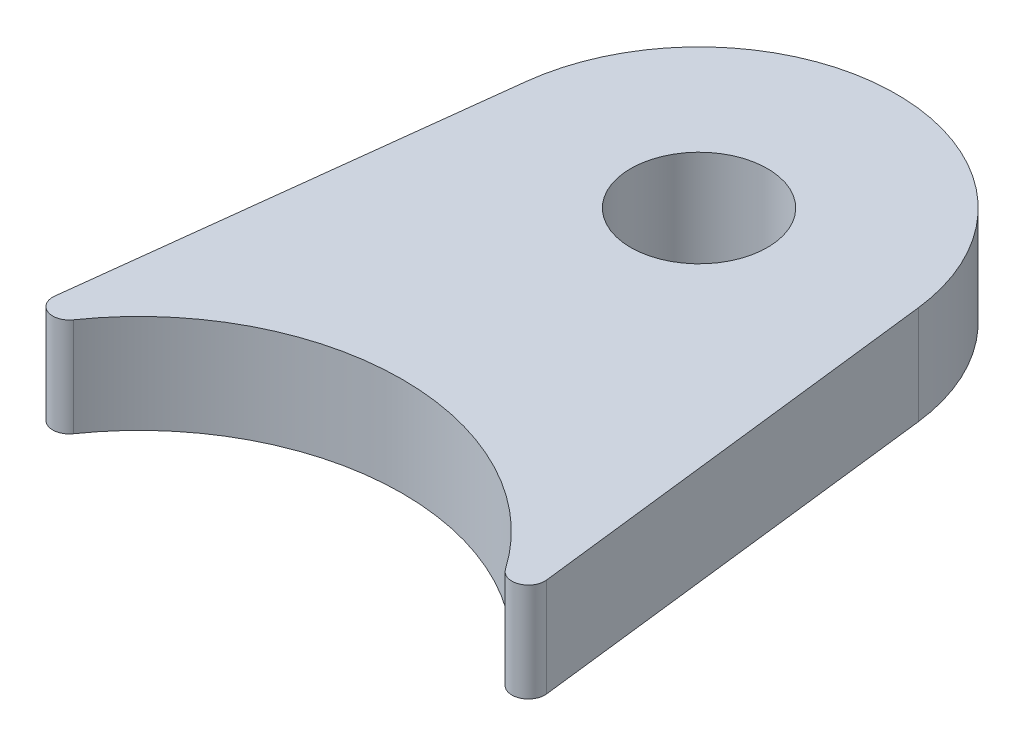
ISO-10303-21;
HEADER;
FILE_DESCRIPTION(('STEP AP214'),'2;1');
FILE_NAME('part.step','',(''),(''),'','','');
FILE_SCHEMA(('AUTOMOTIVE_DESIGN { 1 0 10303 214 1 1 1 1 }'));
ENDSEC;
DATA;
#1=APPLICATION_CONTEXT('core data for automotive mechanical design processes');
#2=APPLICATION_PROTOCOL_DEFINITION('international standard','automotive_design',2000,#1);
#3=PRODUCT_CONTEXT('',#1,'mechanical');
#4=PRODUCT('Part','Part','',(#3));
#5=PRODUCT_RELATED_PRODUCT_CATEGORY('part','',(#4));
#6=PRODUCT_DEFINITION_FORMATION('','',#4);
#7=PRODUCT_DEFINITION_CONTEXT('part definition',#1,'design');
#8=PRODUCT_DEFINITION('design','',#6,#7);
#9=PRODUCT_DEFINITION_SHAPE('','',#8);
#10=(LENGTH_UNIT() NAMED_UNIT(*) SI_UNIT(.MILLI.,.METRE.));
#11=(NAMED_UNIT(*) PLANE_ANGLE_UNIT() SI_UNIT($,.RADIAN.));
#12=(NAMED_UNIT(*) SI_UNIT($,.STERADIAN.) SOLID_ANGLE_UNIT());
#13=UNCERTAINTY_MEASURE_WITH_UNIT(LENGTH_MEASURE(1.E-05),#10,'distance_accuracy_value','');
#14=(GEOMETRIC_REPRESENTATION_CONTEXT(3) GLOBAL_UNCERTAINTY_ASSIGNED_CONTEXT((#13)) GLOBAL_UNIT_ASSIGNED_CONTEXT((#10,
#11,#12)) REPRESENTATION_CONTEXT('',''));
#15=CARTESIAN_POINT('',(0.,0.,0.));
#16=DIRECTION('',(0.,0.,1.));
#17=DIRECTION('',(1.,0.,0.));
#18=AXIS2_PLACEMENT_3D('',#15,#16,#17);
#19=CARTESIAN_POINT('',(0.,4.7625,-27.01869374));
#20=DIRECTION('',(0.,-1.,0.));
#21=DIRECTION('',(0.,0.,-1.));
#22=AXIS2_PLACEMENT_3D('',#19,#20,#21);
#23=CYLINDRICAL_SURFACE('',#22,9.525);
#24=CARTESIAN_POINT('',(0.,0.,-27.01869374));
#25=DIRECTION('',(0.,1.,0.));
#26=DIRECTION('',(0.,0.,1.));
#27=AXIS2_PLACEMENT_3D('',#24,#25,#26);
#28=CIRCLE('',#27,9.525);
#29=CARTESIAN_POINT('',(9.45900654652253,0.,-28.137988228883));
#30=VERTEX_POINT('',#29);
#31=CARTESIAN_POINT('',(-9.45900654652253,0.,-28.137988228883));
#32=VERTEX_POINT('',#31);
#33=EDGE_CURVE('E111',#30,#32,#28,.T.);
#34=ORIENTED_EDGE('',*,*,#33,.T.);
#35=DIRECTION('',(0.,-1.,0.));
#36=VECTOR('',#35,1.);
#37=CARTESIAN_POINT('',(-9.45900654652253,4.7625,-28.137988228883));
#38=LINE('',#37,#36);
#39=CARTESIAN_POINT('',(-9.45900654652253,4.7625,-28.137988228883));
#40=VERTEX_POINT('',#39);
#41=EDGE_CURVE('E96',#40,#32,#38,.T.);
#42=ORIENTED_EDGE('',*,*,#41,.F.);
#43=CARTESIAN_POINT('',(0.,4.7625,-27.01869374));
#44=DIRECTION('',(0.,1.,0.));
#45=DIRECTION('',(0.,0.,1.));
#46=AXIS2_PLACEMENT_3D('',#43,#44,#45);
#47=CIRCLE('',#46,9.525);
#48=CARTESIAN_POINT('',(9.45900654652253,4.7625,-28.137988228883));
#49=VERTEX_POINT('',#48);
#50=EDGE_CURVE('E99',#49,#40,#47,.T.);
#51=ORIENTED_EDGE('',*,*,#50,.F.);
#52=DIRECTION('',(0.,-1.,0.));
#53=VECTOR('',#52,1.);
#54=CARTESIAN_POINT('',(9.45900654652253,4.7625,-28.137988228883));
#55=LINE('',#54,#53);
#56=EDGE_CURVE('E113',#49,#30,#55,.T.);
#57=ORIENTED_EDGE('',*,*,#56,.T.);
#58=EDGE_LOOP('',(#34,#42,#51,#57));
#59=FACE_BOUND('',#58,.T.);
#60=ADVANCED_FACE('F41',(#59),#23,.T.);
#61=CARTESIAN_POINT('',(-12.6120087286967,4.7625,-1.49239265184402));
#62=DIRECTION('',(-0.993071553440686,0.,-0.117511232428663));
#63=DIRECTION('',(-0.117511232428663,0.,0.993071553440686));
#64=AXIS2_PLACEMENT_3D('',#61,#62,#63);
#65=PLANE('',#64);
#66=DIRECTION('',(0.117511232428663,0.,-0.993071553440686));
#67=VECTOR('',#66,1.);
#68=CARTESIAN_POINT('',(-12.6120087286967,0.,-1.49239265184402));
#69=LINE('',#68,#67);
#70=CARTESIAN_POINT('',(-11.8658124027747,0.,-7.79839701619237));
#71=VERTEX_POINT('',#70);
#72=EDGE_CURVE('E146',#71,#32,#69,.T.);
#73=ORIENTED_EDGE('',*,*,#72,.F.);
#74=DIRECTION('',(0.,-1.,0.));
#75=VECTOR('',#74,1.);
#76=CARTESIAN_POINT('',(-11.8658124027747,4.7625,-7.79839701619237));
#77=LINE('',#76,#75);
#78=CARTESIAN_POINT('',(-11.8658124027747,4.7625,-7.79839701619237));
#79=VERTEX_POINT('',#78);
#80=EDGE_CURVE('E11',#71,#79,#77,.F.);
#81=ORIENTED_EDGE('',*,*,#80,.T.);
#82=DIRECTION('',(0.117511232428663,0.,-0.993071553440686));
#83=VECTOR('',#82,1.);
#84=CARTESIAN_POINT('',(-12.6120087286967,4.7625,-1.49239265184402));
#85=LINE('',#84,#83);
#86=EDGE_CURVE('E92',#79,#40,#85,.T.);
#87=ORIENTED_EDGE('',*,*,#86,.T.);
#88=ORIENTED_EDGE('',*,*,#41,.T.);
#89=EDGE_LOOP('',(#73,#81,#87,#88));
#90=FACE_BOUND('',#89,.T.);
#91=ADVANCED_FACE('F94',(#90),#65,.T.);
#92=CARTESIAN_POINT('',(0.,4.7625,0.));
#93=DIRECTION('',(0.,-1.,0.));
#94=DIRECTION('',(0.,0.,-1.));
#95=AXIS2_PLACEMENT_3D('',#92,#93,#94);
#96=CYLINDRICAL_SURFACE('',#95,12.7);
#97=CARTESIAN_POINT('',(0.,0.,0.));
#98=DIRECTION('',(0.,1.,0.));
#99=DIRECTION('',(0.,0.,1.));
#100=AXIS2_PLACEMENT_3D('',#97,#98,#99);
#101=CIRCLE('',#100,12.7);
#102=CARTESIAN_POINT('',(10.4259405715117,0.,-7.25187997689612));
#103=VERTEX_POINT('',#102);
#104=CARTESIAN_POINT('',(-10.4259405715117,0.,-7.25187997689612));
#105=VERTEX_POINT('',#104);
#106=EDGE_CURVE('E142',#103,#105,#101,.T.);
#107=ORIENTED_EDGE('',*,*,#106,.F.);
#108=DIRECTION('',(0.,-1.,0.));
#109=VECTOR('',#108,1.);
#110=CARTESIAN_POINT('',(10.4259405715117,4.7625,-7.25187997689612));
#111=LINE('',#110,#109);
#112=CARTESIAN_POINT('',(10.4259405715117,4.7625,-7.25187997689612));
#113=VERTEX_POINT('',#112);
#114=EDGE_CURVE('E127',#103,#113,#111,.F.);
#115=ORIENTED_EDGE('',*,*,#114,.T.);
#116=CARTESIAN_POINT('',(0.,4.7625,0.));
#117=DIRECTION('',(0.,1.,0.));
#118=DIRECTION('',(0.,0.,1.));
#119=AXIS2_PLACEMENT_3D('',#116,#117,#118);
#120=CIRCLE('',#119,12.7);
#121=CARTESIAN_POINT('',(-10.4259405715117,4.7625,-7.25187997689612));
#122=VERTEX_POINT('',#121);
#123=EDGE_CURVE('E98',#113,#122,#120,.T.);
#124=ORIENTED_EDGE('',*,*,#123,.T.);
#125=DIRECTION('',(0.,-1.,0.));
#126=VECTOR('',#125,1.);
#127=CARTESIAN_POINT('',(-10.4259405715117,4.7625,-7.25187997689612));
#128=LINE('',#127,#126);
#129=EDGE_CURVE('E124',#122,#105,#128,.T.);
#130=ORIENTED_EDGE('',*,*,#129,.T.);
#131=EDGE_LOOP('',(#107,#115,#124,#130));
#132=FACE_BOUND('',#131,.T.);
#133=ADVANCED_FACE('F144',(#132),#96,.F.);
#134=CARTESIAN_POINT('',(12.6120087286967,4.7625,-1.49239265184402));
#135=DIRECTION('',(-0.993071553440686,0.,0.117511232428663));
#136=DIRECTION('',(0.117511232428663,0.,0.993071553440686));
#137=AXIS2_PLACEMENT_3D('',#134,#135,#136);
#138=PLANE('',#137);
#139=DIRECTION('',(-0.117511232428663,0.,-0.993071553440686));
#140=VECTOR('',#139,1.);
#141=CARTESIAN_POINT('',(12.6120087286967,4.7625,-1.49239265184402));
#142=LINE('',#141,#140);
#143=CARTESIAN_POINT('',(11.8658124027747,4.7625,-7.79839701619237));
#144=VERTEX_POINT('',#143);
#145=EDGE_CURVE('E104',#144,#49,#142,.T.);
#146=ORIENTED_EDGE('',*,*,#145,.F.);
#147=DIRECTION('',(0.,1.,0.));
#148=VECTOR('',#147,1.);
#149=CARTESIAN_POINT('',(11.8658124027747,0.,-7.79839701619238));
#150=LINE('',#149,#148);
#151=CARTESIAN_POINT('',(11.8658124027747,0.,-7.79839701619237));
#152=VERTEX_POINT('',#151);
#153=EDGE_CURVE('E112',#144,#152,#150,.F.);
#154=ORIENTED_EDGE('',*,*,#153,.T.);
#155=DIRECTION('',(-0.117511232428663,0.,-0.993071553440686));
#156=VECTOR('',#155,1.);
#157=CARTESIAN_POINT('',(12.6120087286967,0.,-1.49239265184402));
#158=LINE('',#157,#156);
#159=EDGE_CURVE('E108',#152,#30,#158,.T.);
#160=ORIENTED_EDGE('',*,*,#159,.T.);
#161=ORIENTED_EDGE('',*,*,#56,.F.);
#162=EDGE_LOOP('',(#146,#154,#160,#161));
#163=FACE_BOUND('',#162,.T.);
#164=ADVANCED_FACE('F134',(#163),#138,.F.);
#165=CARTESIAN_POINT('',(0.,4.7625,0.));
#166=DIRECTION('',(0.,1.,0.));
#167=DIRECTION('',(0.,0.,1.));
#168=AXIS2_PLACEMENT_3D('',#165,#166,#167);
#169=PLANE('',#168);
#170=CARTESIAN_POINT('',(0.,4.7625,-27.01869374));
#171=DIRECTION('',(0.,1.,0.));
#172=DIRECTION('',(0.,0.,1.));
#173=AXIS2_PLACEMENT_3D('',#170,#171,#172);
#174=CIRCLE('',#173,3.3);
#175=CARTESIAN_POINT('',(0.,4.7625,-23.71869374));
#176=VERTEX_POINT('',#175);
#177=EDGE_CURVE('E155',#176,#176,#174,.T.);
#178=ORIENTED_EDGE('',*,*,#177,.F.);
#179=EDGE_LOOP('',(#178));
#180=FACE_BOUND('',#179,.T.);
#181=ORIENTED_EDGE('',*,*,#123,.F.);
#182=CARTESIAN_POINT('',(11.0775618572312,4.7625,-7.70512247545212));
#183=DIRECTION('',(0.,1.,0.));
#184=DIRECTION('',(0.,0.,1.));
#185=AXIS2_PLACEMENT_3D('',#182,#183,#184);
#186=CIRCLE('',#185,0.79375);
#187=EDGE_CURVE('E49',#113,#144,#186,.T.);
#188=ORIENTED_EDGE('',*,*,#187,.T.);
#189=ORIENTED_EDGE('',*,*,#145,.T.);
#190=ORIENTED_EDGE('',*,*,#50,.T.);
#191=ORIENTED_EDGE('',*,*,#86,.F.);
#192=CARTESIAN_POINT('',(-11.0775618572312,4.7625,-7.70512247545212));
#193=DIRECTION('',(0.,1.,0.));
#194=DIRECTION('',(0.,0.,1.));
#195=AXIS2_PLACEMENT_3D('',#192,#193,#194);
#196=CIRCLE('',#195,0.79375);
#197=EDGE_CURVE('E61',#79,#122,#196,.T.);
#198=ORIENTED_EDGE('',*,*,#197,.T.);
#199=EDGE_LOOP('',(#181,#188,#189,#190,#191,#198));
#200=FACE_BOUND('',#199,.T.);
#201=ADVANCED_FACE('F102',(#180,#200),#169,.T.);
#202=CARTESIAN_POINT('',(0.,0.,0.));
#203=DIRECTION('',(0.,1.,0.));
#204=DIRECTION('',(0.,0.,1.));
#205=AXIS2_PLACEMENT_3D('',#202,#203,#204);
#206=PLANE('',#205);
#207=CARTESIAN_POINT('',(0.,0.,-27.01869374));
#208=DIRECTION('',(0.,1.,0.));
#209=DIRECTION('',(0.,0.,1.));
#210=AXIS2_PLACEMENT_3D('',#207,#208,#209);
#211=CIRCLE('',#210,3.3);
#212=CARTESIAN_POINT('',(0.,0.,-23.71869374));
#213=VERTEX_POINT('',#212);
#214=EDGE_CURVE('E150',#213,#213,#211,.T.);
#215=ORIENTED_EDGE('',*,*,#214,.T.);
#216=EDGE_LOOP('',(#215));
#217=FACE_BOUND('',#216,.T.);
#218=ORIENTED_EDGE('',*,*,#159,.F.);
#219=CARTESIAN_POINT('',(11.0775618572312,0.,-7.70512247545212));
#220=DIRECTION('',(0.,1.,0.));
#221=DIRECTION('',(0.,0.,1.));
#222=AXIS2_PLACEMENT_3D('',#219,#220,#221);
#223=CIRCLE('',#222,0.79375);
#224=EDGE_CURVE('E122',#152,#103,#223,.F.);
#225=ORIENTED_EDGE('',*,*,#224,.T.);
#226=ORIENTED_EDGE('',*,*,#106,.T.);
#227=CARTESIAN_POINT('',(-11.0775618572312,0.,-7.70512247545212));
#228=DIRECTION('',(0.,1.,0.));
#229=DIRECTION('',(0.,0.,1.));
#230=AXIS2_PLACEMENT_3D('',#227,#228,#229);
#231=CIRCLE('',#230,0.79375);
#232=EDGE_CURVE('E116',#105,#71,#231,.F.);
#233=ORIENTED_EDGE('',*,*,#232,.T.);
#234=ORIENTED_EDGE('',*,*,#72,.T.);
#235=ORIENTED_EDGE('',*,*,#33,.F.);
#236=EDGE_LOOP('',(#218,#225,#226,#233,#234,#235));
#237=FACE_BOUND('',#236,.T.);
#238=ADVANCED_FACE('F141',(#217,#237),#206,.F.);
#239=CARTESIAN_POINT('',(11.0775618572312,4.7625,-7.70512247545212));
#240=DIRECTION('',(0.,-1.,0.));
#241=DIRECTION('',(0.,0.,-1.));
#242=AXIS2_PLACEMENT_3D('',#239,#240,#241);
#243=CYLINDRICAL_SURFACE('',#242,0.79375);
#244=ORIENTED_EDGE('',*,*,#187,.F.);
#245=ORIENTED_EDGE('',*,*,#114,.F.);
#246=ORIENTED_EDGE('',*,*,#224,.F.);
#247=ORIENTED_EDGE('',*,*,#153,.F.);
#248=EDGE_LOOP('',(#244,#245,#246,#247));
#249=FACE_BOUND('',#248,.T.);
#250=ADVANCED_FACE('F137',(#249),#243,.T.);
#251=CARTESIAN_POINT('',(-11.0775618572312,4.7625,-7.70512247545212));
#252=DIRECTION('',(0.,-1.,0.));
#253=DIRECTION('',(0.,0.,-1.));
#254=AXIS2_PLACEMENT_3D('',#251,#252,#253);
#255=CYLINDRICAL_SURFACE('',#254,0.79375);
#256=ORIENTED_EDGE('',*,*,#197,.F.);
#257=ORIENTED_EDGE('',*,*,#80,.F.);
#258=ORIENTED_EDGE('',*,*,#232,.F.);
#259=ORIENTED_EDGE('',*,*,#129,.F.);
#260=EDGE_LOOP('',(#256,#257,#258,#259));
#261=FACE_BOUND('',#260,.T.);
#262=ADVANCED_FACE('F43',(#261),#255,.T.);
#263=CARTESIAN_POINT('',(0.,4.7625,-27.01869374));
#264=DIRECTION('',(0.,1.,0.));
#265=DIRECTION('',(0.,0.,1.));
#266=AXIS2_PLACEMENT_3D('',#263,#264,#265);
#267=CYLINDRICAL_SURFACE('',#266,3.3);
#268=ORIENTED_EDGE('',*,*,#214,.F.);
#269=EDGE_LOOP('',(#268));
#270=FACE_BOUND('',#269,.T.);
#271=ORIENTED_EDGE('',*,*,#177,.T.);
#272=EDGE_LOOP('',(#271));
#273=FACE_BOUND('',#272,.T.);
#274=ADVANCED_FACE('F159',(#270,#273),#267,.F.);
#275=CLOSED_SHELL('',(#60,#91,#133,#164,#201,#238,#250,#262,#274));
#276=MANIFOLD_SOLID_BREP('B2',#275);
#277=ADVANCED_BREP_SHAPE_REPRESENTATION('',(#18,#276),#14);
#278=SHAPE_DEFINITION_REPRESENTATION(#9,#277);
ENDSEC;
END-ISO-10303-21;
